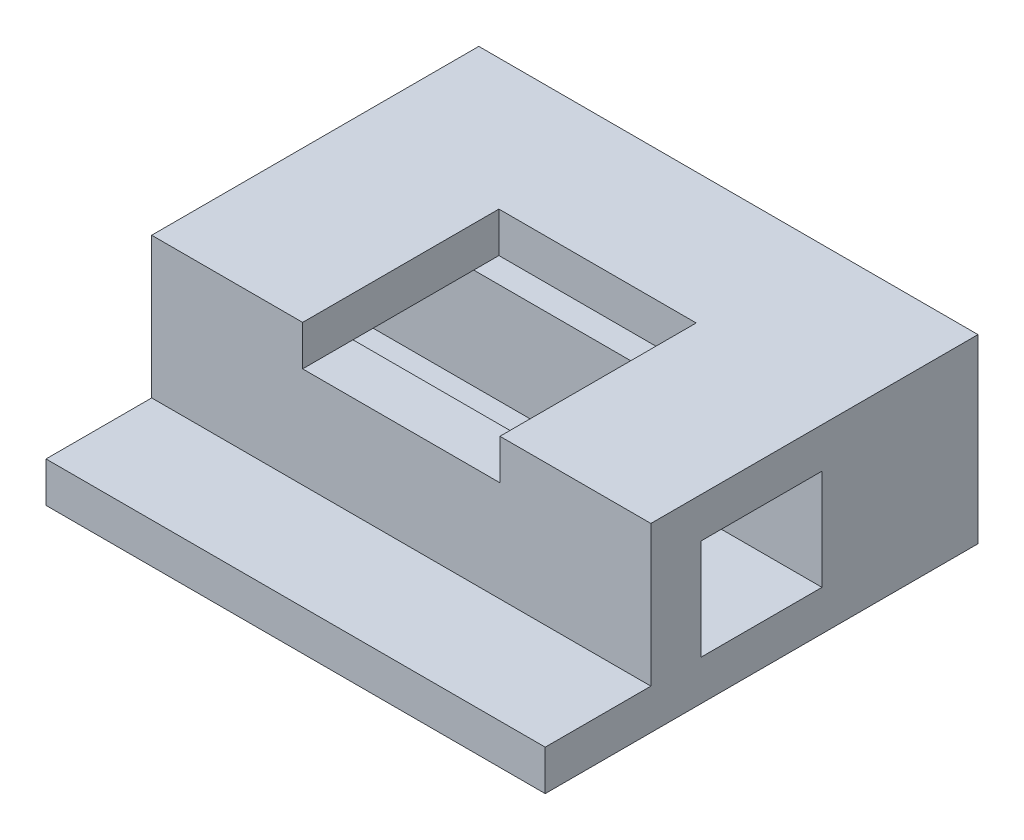
ISO-10303-21;
HEADER;
FILE_DESCRIPTION(('STEP AP214'),'2;1');
FILE_NAME('part.step','',(''),(''),'','','');
FILE_SCHEMA(('AUTOMOTIVE_DESIGN { 1 0 10303 214 1 1 1 1 }'));
ENDSEC;
DATA;
#1=APPLICATION_CONTEXT('core data for automotive mechanical design processes');
#2=APPLICATION_PROTOCOL_DEFINITION('international standard','automotive_design',2000,#1);
#3=PRODUCT_CONTEXT('',#1,'mechanical');
#4=PRODUCT('Part','Part','',(#3));
#5=PRODUCT_RELATED_PRODUCT_CATEGORY('part','',(#4));
#6=PRODUCT_DEFINITION_FORMATION('','',#4);
#7=PRODUCT_DEFINITION_CONTEXT('part definition',#1,'design');
#8=PRODUCT_DEFINITION('design','',#6,#7);
#9=PRODUCT_DEFINITION_SHAPE('','',#8);
#10=(LENGTH_UNIT() NAMED_UNIT(*) SI_UNIT(.MILLI.,.METRE.));
#11=(NAMED_UNIT(*) PLANE_ANGLE_UNIT() SI_UNIT($,.RADIAN.));
#12=(NAMED_UNIT(*) SI_UNIT($,.STERADIAN.) SOLID_ANGLE_UNIT());
#13=UNCERTAINTY_MEASURE_WITH_UNIT(LENGTH_MEASURE(1.E-05),#10,'distance_accuracy_value','');
#14=(GEOMETRIC_REPRESENTATION_CONTEXT(3) GLOBAL_UNCERTAINTY_ASSIGNED_CONTEXT((#13)) GLOBAL_UNIT_ASSIGNED_CONTEXT((#10,
#11,#12)) REPRESENTATION_CONTEXT('',''));
#15=CARTESIAN_POINT('',(0.,0.,0.));
#16=DIRECTION('',(0.,0.,1.));
#17=DIRECTION('',(1.,0.,0.));
#18=AXIS2_PLACEMENT_3D('',#15,#16,#17);
#19=CARTESIAN_POINT('',(-24.8,5.98999999999997,3.00000000000001));
#20=DIRECTION('',(0.,0.,1.));
#21=DIRECTION('',(1.,0.,0.));
#22=AXIS2_PLACEMENT_3D('',#19,#20,#21);
#23=PLANE('',#22);
#24=DIRECTION('',(0.,1.,0.));
#25=VECTOR('',#24,1.);
#26=CARTESIAN_POINT('',(24.8,0.,3.00000000000001));
#27=LINE('',#26,#25);
#28=CARTESIAN_POINT('',(24.8,5.99999999999999,3.00000000000001));
#29=VERTEX_POINT('',#28);
#30=CARTESIAN_POINT('',(24.8,10.,3.00000000000001));
#31=VERTEX_POINT('',#30);
#32=EDGE_CURVE('E40',#29,#31,#27,.T.);
#33=ORIENTED_EDGE('',*,*,#32,.T.);
#34=DIRECTION('',(-1.,0.,0.));
#35=VECTOR('',#34,1.);
#36=CARTESIAN_POINT('',(-35.,10.,3.00000000000001));
#37=LINE('',#36,#35);
#38=CARTESIAN_POINT('',(-24.8,10.,3.00000000000001));
#39=VERTEX_POINT('',#38);
#40=EDGE_CURVE('E169',#31,#39,#37,.T.);
#41=ORIENTED_EDGE('',*,*,#40,.T.);
#42=DIRECTION('',(0.,1.,0.));
#43=VECTOR('',#42,1.);
#44=CARTESIAN_POINT('',(-24.8,0.,3.00000000000001));
#45=LINE('',#44,#43);
#46=CARTESIAN_POINT('',(-24.8,5.99999999999999,3.00000000000001));
#47=VERTEX_POINT('',#46);
#48=EDGE_CURVE('E54',#47,#39,#45,.T.);
#49=ORIENTED_EDGE('',*,*,#48,.F.);
#50=DIRECTION('',(1.,0.,0.));
#51=VECTOR('',#50,1.);
#52=CARTESIAN_POINT('',(-50.,5.99999999999999,3.00000000000001));
#53=LINE('',#52,#51);
#54=EDGE_CURVE('E173',#47,#29,#53,.T.);
#55=ORIENTED_EDGE('',*,*,#54,.T.);
#56=EDGE_LOOP('',(#33,#41,#49,#55));
#57=FACE_BOUND('',#56,.T.);
#58=ADVANCED_FACE('F36',(#57),#23,.T.);
#59=CARTESIAN_POINT('',(-35.,10.,-35.));
#60=DIRECTION('',(0.,-1.,0.));
#61=DIRECTION('',(0.,0.,-1.));
#62=AXIS2_PLACEMENT_3D('',#59,#60,#61);
#63=PLANE('',#62);
#64=ORIENTED_EDGE('',*,*,#40,.F.);
#65=DIRECTION('',(0.,0.,-1.));
#66=VECTOR('',#65,1.);
#67=CARTESIAN_POINT('',(24.8,10.,3.));
#68=LINE('',#67,#66);
#69=CARTESIAN_POINT('',(24.8,10.,-7.49999999999999));
#70=VERTEX_POINT('',#69);
#71=EDGE_CURVE('E157',#31,#70,#68,.T.);
#72=ORIENTED_EDGE('',*,*,#71,.T.);
#73=DIRECTION('',(-1.,0.,0.));
#74=VECTOR('',#73,1.);
#75=CARTESIAN_POINT('',(15.,10.,-7.49999999999999));
#76=LINE('',#75,#74);
#77=CARTESIAN_POINT('',(-24.8,10.,-7.49999999999998));
#78=VERTEX_POINT('',#77);
#79=EDGE_CURVE('E204',#70,#78,#76,.T.);
#80=ORIENTED_EDGE('',*,*,#79,.T.);
#81=DIRECTION('',(0.,0.,1.));
#82=VECTOR('',#81,1.);
#83=CARTESIAN_POINT('',(-24.8,10.,3.));
#84=LINE('',#83,#82);
#85=EDGE_CURVE('E46',#78,#39,#84,.T.);
#86=ORIENTED_EDGE('',*,*,#85,.T.);
#87=EDGE_LOOP('',(#64,#72,#80,#86));
#88=FACE_BOUND('',#87,.T.);
#89=ADVANCED_FACE('F170',(#88),#63,.F.);
#90=CARTESIAN_POINT('',(-50.,6.,-40.));
#91=DIRECTION('',(0.,1.,0.));
#92=DIRECTION('',(0.,0.,1.));
#93=AXIS2_PLACEMENT_3D('',#90,#91,#92);
#94=PLANE('',#93);
#95=ORIENTED_EDGE('',*,*,#54,.F.);
#96=DIRECTION('',(0.,0.,1.));
#97=VECTOR('',#96,1.);
#98=CARTESIAN_POINT('',(-24.8,6.,-40.));
#99=LINE('',#98,#97);
#100=CARTESIAN_POINT('',(-24.8,6.00000000000001,-40.));
#101=VERTEX_POINT('',#100);
#102=EDGE_CURVE('E202',#101,#47,#99,.T.);
#103=ORIENTED_EDGE('',*,*,#102,.F.);
#104=DIRECTION('',(-1.,0.,0.));
#105=VECTOR('',#104,1.);
#106=CARTESIAN_POINT('',(-50.,6.00000000000001,-40.));
#107=LINE('',#106,#105);
#108=CARTESIAN_POINT('',(24.8,6.,-40.));
#109=VERTEX_POINT('',#108);
#110=EDGE_CURVE('E172',#109,#101,#107,.T.);
#111=ORIENTED_EDGE('',*,*,#110,.F.);
#112=DIRECTION('',(0.,0.,-1.));
#113=VECTOR('',#112,1.);
#114=CARTESIAN_POINT('',(24.8,6.,-40.));
#115=LINE('',#114,#113);
#116=EDGE_CURVE('E200',#29,#109,#115,.T.);
#117=ORIENTED_EDGE('',*,*,#116,.F.);
#118=EDGE_LOOP('',(#95,#103,#111,#117));
#119=FACE_BOUND('',#118,.T.);
#120=ADVANCED_FACE('F38',(#119),#94,.F.);
#121=CARTESIAN_POINT('',(-24.8,20.,-7.49999999999999));
#122=DIRECTION('',(0.,0.,-1.));
#123=DIRECTION('',(-1.,0.,0.));
#124=AXIS2_PLACEMENT_3D('',#121,#122,#123);
#125=PLANE('',#124);
#126=ORIENTED_EDGE('',*,*,#79,.F.);
#127=DIRECTION('',(0.,1.,0.));
#128=VECTOR('',#127,1.);
#129=CARTESIAN_POINT('',(24.8,-40.6992110392263,-7.5));
#130=LINE('',#129,#128);
#131=CARTESIAN_POINT('',(24.8,24.,-7.49999999999999));
#132=VERTEX_POINT('',#131);
#133=EDGE_CURVE('E165',#70,#132,#130,.T.);
#134=ORIENTED_EDGE('',*,*,#133,.T.);
#135=DIRECTION('',(-1.,0.,0.));
#136=VECTOR('',#135,1.);
#137=CARTESIAN_POINT('',(-24.8,24.,-7.49999999999999));
#138=LINE('',#137,#136);
#139=CARTESIAN_POINT('',(9.80000000000002,24.,-7.49999999999999));
#140=VERTEX_POINT('',#139);
#141=EDGE_CURVE('E194',#132,#140,#138,.T.);
#142=ORIENTED_EDGE('',*,*,#141,.T.);
#143=DIRECTION('',(0.,-1.,0.));
#144=VECTOR('',#143,1.);
#145=CARTESIAN_POINT('',(9.80000000000002,25.,-7.49999999999999));
#146=LINE('',#145,#144);
#147=CARTESIAN_POINT('',(9.80000000000002,20.,-7.49999999999999));
#148=VERTEX_POINT('',#147);
#149=EDGE_CURVE('E214',#140,#148,#146,.T.);
#150=ORIENTED_EDGE('',*,*,#149,.T.);
#151=DIRECTION('',(1.,0.,0.));
#152=VECTOR('',#151,1.);
#153=CARTESIAN_POINT('',(-24.8,20.,-7.49999999999999));
#154=LINE('',#153,#152);
#155=CARTESIAN_POINT('',(-9.8,20.,-7.49999999999999));
#156=VERTEX_POINT('',#155);
#157=EDGE_CURVE('E244',#156,#148,#154,.T.);
#158=ORIENTED_EDGE('',*,*,#157,.F.);
#159=DIRECTION('',(0.,-1.,0.));
#160=VECTOR('',#159,1.);
#161=CARTESIAN_POINT('',(-9.8,25.,-7.49999999999999));
#162=LINE('',#161,#160);
#163=CARTESIAN_POINT('',(-9.8,24.,-7.49999999999999));
#164=VERTEX_POINT('',#163);
#165=EDGE_CURVE('E234',#164,#156,#162,.T.);
#166=ORIENTED_EDGE('',*,*,#165,.F.);
#167=CARTESIAN_POINT('',(-24.8,24.,-7.49999999999998));
#168=VERTEX_POINT('',#167);
#169=EDGE_CURVE('E67',#164,#168,#138,.T.);
#170=ORIENTED_EDGE('',*,*,#169,.T.);
#171=DIRECTION('',(0.,1.,0.));
#172=VECTOR('',#171,1.);
#173=CARTESIAN_POINT('',(-24.8,-40.6992110392263,-7.49999999999999));
#174=LINE('',#173,#172);
#175=EDGE_CURVE('E11',#78,#168,#174,.T.);
#176=ORIENTED_EDGE('',*,*,#175,.F.);
#177=EDGE_LOOP('',(#126,#134,#142,#150,#158,#166,#170,#176));
#178=FACE_BOUND('',#177,.T.);
#179=ADVANCED_FACE('F283',(#178),#125,.F.);
#180=CARTESIAN_POINT('',(-24.8,89.2753352012447,-27.));
#181=DIRECTION('',(0.,0.,-1.));
#182=DIRECTION('',(-1.,0.,0.));
#183=AXIS2_PLACEMENT_3D('',#180,#181,#182);
#184=PLANE('',#183);
#185=DIRECTION('',(0.,1.,0.));
#186=VECTOR('',#185,1.);
#187=CARTESIAN_POINT('',(9.80000000000002,20.,-27.));
#188=LINE('',#187,#186);
#189=CARTESIAN_POINT('',(9.80000000000002,20.,-27.));
#190=VERTEX_POINT('',#189);
#191=CARTESIAN_POINT('',(9.80000000000002,24.,-27.));
#192=VERTEX_POINT('',#191);
#193=EDGE_CURVE('E206',#190,#192,#188,.T.);
#194=ORIENTED_EDGE('',*,*,#193,.T.);
#195=DIRECTION('',(-1.,0.,0.));
#196=VECTOR('',#195,1.);
#197=CARTESIAN_POINT('',(-24.8,24.,-27.));
#198=LINE('',#197,#196);
#199=CARTESIAN_POINT('',(-9.80000000000001,24.,-27.));
#200=VERTEX_POINT('',#199);
#201=EDGE_CURVE('E191',#192,#200,#198,.T.);
#202=ORIENTED_EDGE('',*,*,#201,.T.);
#203=DIRECTION('',(0.,-1.,0.));
#204=VECTOR('',#203,1.);
#205=CARTESIAN_POINT('',(-9.80000000000001,25.,-27.));
#206=LINE('',#205,#204);
#207=CARTESIAN_POINT('',(-9.80000000000001,20.,-27.));
#208=VERTEX_POINT('',#207);
#209=EDGE_CURVE('E209',#200,#208,#206,.T.);
#210=ORIENTED_EDGE('',*,*,#209,.T.);
#211=DIRECTION('',(1.,0.,0.));
#212=VECTOR('',#211,1.);
#213=CARTESIAN_POINT('',(-9.80000000000001,20.,-27.));
#214=LINE('',#213,#212);
#215=EDGE_CURVE('E211',#208,#190,#214,.T.);
#216=ORIENTED_EDGE('',*,*,#215,.T.);
#217=EDGE_LOOP('',(#194,#202,#210,#216));
#218=FACE_BOUND('',#217,.T.);
#219=ADVANCED_FACE('F328',(#218),#184,.F.);
#220=CARTESIAN_POINT('',(0.,20.,0.));
#221=DIRECTION('',(0.,1.,0.));
#222=DIRECTION('',(0.,0.,1.));
#223=AXIS2_PLACEMENT_3D('',#220,#221,#222);
#224=PLANE('',#223);
#225=DIRECTION('',(0.,0.,1.));
#226=VECTOR('',#225,1.);
#227=CARTESIAN_POINT('',(9.80000000000002,20.,-29.5));
#228=LINE('',#227,#226);
#229=CARTESIAN_POINT('',(9.80000000000002,20.,-24.5));
#230=VERTEX_POINT('',#229);
#231=EDGE_CURVE('E217',#190,#230,#228,.T.);
#232=ORIENTED_EDGE('',*,*,#231,.F.);
#233=ORIENTED_EDGE('',*,*,#215,.F.);
#234=DIRECTION('',(0.,0.,-1.));
#235=VECTOR('',#234,1.);
#236=CARTESIAN_POINT('',(-9.80000000000001,20.,-29.5));
#237=LINE('',#236,#235);
#238=CARTESIAN_POINT('',(-9.80000000000001,20.,-24.5));
#239=VERTEX_POINT('',#238);
#240=EDGE_CURVE('E229',#239,#208,#237,.T.);
#241=ORIENTED_EDGE('',*,*,#240,.F.);
#242=DIRECTION('',(1.,0.,0.));
#243=VECTOR('',#242,1.);
#244=CARTESIAN_POINT('',(-24.8,20.,-24.5));
#245=LINE('',#244,#243);
#246=EDGE_CURVE('E255',#239,#230,#245,.T.);
#247=ORIENTED_EDGE('',*,*,#246,.T.);
#248=EDGE_LOOP('',(#232,#233,#241,#247));
#249=FACE_BOUND('',#248,.T.);
#250=ADVANCED_FACE('F326',(#249),#224,.T.);
#251=CARTESIAN_POINT('',(-9.80000000000001,25.,-29.5));
#252=DIRECTION('',(-1.,0.,0.));
#253=DIRECTION('',(0.,0.,1.));
#254=AXIS2_PLACEMENT_3D('',#251,#252,#253);
#255=PLANE('',#254);
#256=ORIENTED_EDGE('',*,*,#209,.F.);
#257=DIRECTION('',(0.,0.,1.));
#258=VECTOR('',#257,1.);
#259=CARTESIAN_POINT('',(-9.80000000000001,24.,-29.5));
#260=LINE('',#259,#258);
#261=EDGE_CURVE('E197',#200,#164,#260,.T.);
#262=ORIENTED_EDGE('',*,*,#261,.T.);
#263=ORIENTED_EDGE('',*,*,#165,.T.);
#264=CARTESIAN_POINT('',(-9.8,20.,-12.5));
#265=VERTEX_POINT('',#264);
#266=EDGE_CURVE('E230',#156,#265,#237,.T.);
#267=ORIENTED_EDGE('',*,*,#266,.T.);
#268=EDGE_CURVE('E233',#265,#239,#237,.T.);
#269=ORIENTED_EDGE('',*,*,#268,.T.);
#270=ORIENTED_EDGE('',*,*,#240,.T.);
#271=EDGE_LOOP('',(#256,#262,#263,#267,#269,#270));
#272=FACE_BOUND('',#271,.T.);
#273=ADVANCED_FACE('F286',(#272),#255,.F.);
#274=CARTESIAN_POINT('',(9.80000000000002,25.,-29.5));
#275=DIRECTION('',(1.,0.,0.));
#276=DIRECTION('',(0.,0.,-1.));
#277=AXIS2_PLACEMENT_3D('',#274,#275,#276);
#278=PLANE('',#277);
#279=ORIENTED_EDGE('',*,*,#149,.F.);
#280=DIRECTION('',(0.,0.,-1.));
#281=VECTOR('',#280,1.);
#282=CARTESIAN_POINT('',(9.80000000000002,24.,-29.5));
#283=LINE('',#282,#281);
#284=EDGE_CURVE('E188',#140,#192,#283,.T.);
#285=ORIENTED_EDGE('',*,*,#284,.T.);
#286=ORIENTED_EDGE('',*,*,#193,.F.);
#287=ORIENTED_EDGE('',*,*,#231,.T.);
#288=CARTESIAN_POINT('',(9.80000000000002,20.,-12.5));
#289=VERTEX_POINT('',#288);
#290=EDGE_CURVE('E219',#230,#289,#228,.T.);
#291=ORIENTED_EDGE('',*,*,#290,.T.);
#292=EDGE_CURVE('E216',#289,#148,#228,.T.);
#293=ORIENTED_EDGE('',*,*,#292,.T.);
#294=EDGE_LOOP('',(#279,#285,#286,#287,#291,#293));
#295=FACE_BOUND('',#294,.T.);
#296=ADVANCED_FACE('F296',(#295),#278,.F.);
#297=CARTESIAN_POINT('',(0.,20.,0.));
#298=DIRECTION('',(0.,1.,0.));
#299=DIRECTION('',(0.,0.,1.));
#300=AXIS2_PLACEMENT_3D('',#297,#298,#299);
#301=PLANE('',#300);
#302=ORIENTED_EDGE('',*,*,#157,.T.);
#303=ORIENTED_EDGE('',*,*,#292,.F.);
#304=DIRECTION('',(-1.,0.,0.));
#305=VECTOR('',#304,1.);
#306=CARTESIAN_POINT('',(-24.8,20.,-12.5));
#307=LINE('',#306,#305);
#308=EDGE_CURVE('E249',#289,#265,#307,.T.);
#309=ORIENTED_EDGE('',*,*,#308,.T.);
#310=ORIENTED_EDGE('',*,*,#266,.F.);
#311=EDGE_LOOP('',(#302,#303,#309,#310));
#312=FACE_BOUND('',#311,.T.);
#313=ADVANCED_FACE('F293',(#312),#301,.T.);
#314=DIRECTION('',(-1.,0.,0.));
#315=VECTOR('',#314,1.);
#316=CARTESIAN_POINT('',(-24.8,10.,-12.5));
#317=LINE('',#316,#315);
#318=CARTESIAN_POINT('',(24.8,10.,-12.5));
#319=VERTEX_POINT('',#318);
#320=CARTESIAN_POINT('',(-24.8,10.,-12.5));
#321=VERTEX_POINT('',#320);
#322=EDGE_CURVE('E241',#319,#321,#317,.T.);
#323=ORIENTED_EDGE('',*,*,#322,.F.);
#324=DIRECTION('',(0.,0.,1.));
#325=VECTOR('',#324,1.);
#326=CARTESIAN_POINT('',(24.8,10.,-40.));
#327=LINE('',#326,#325);
#328=CARTESIAN_POINT('',(24.8,10.,-24.5));
#329=VERTEX_POINT('',#328);
#330=EDGE_CURVE('E266',#329,#319,#327,.T.);
#331=ORIENTED_EDGE('',*,*,#330,.F.);
#332=DIRECTION('',(1.,0.,0.));
#333=VECTOR('',#332,1.);
#334=CARTESIAN_POINT('',(-24.8,10.,-24.5));
#335=LINE('',#334,#333);
#336=CARTESIAN_POINT('',(-24.8,10.,-24.5));
#337=VERTEX_POINT('',#336);
#338=EDGE_CURVE('E245',#337,#329,#335,.T.);
#339=ORIENTED_EDGE('',*,*,#338,.F.);
#340=DIRECTION('',(0.,0.,-1.));
#341=VECTOR('',#340,1.);
#342=CARTESIAN_POINT('',(-24.8,10.,-40.));
#343=LINE('',#342,#341);
#344=EDGE_CURVE('E264',#321,#337,#343,.T.);
#345=ORIENTED_EDGE('',*,*,#344,.F.);
#346=EDGE_LOOP('',(#323,#331,#339,#345));
#347=FACE_BOUND('',#346,.T.);
#348=ADVANCED_FACE('F319',(#347),#63,.F.);
#349=CARTESIAN_POINT('',(24.8,0.,-40.));
#350=DIRECTION('',(-1.,0.,0.));
#351=DIRECTION('',(0.,0.,1.));
#352=AXIS2_PLACEMENT_3D('',#349,#350,#351);
#353=PLANE('',#352);
#354=ORIENTED_EDGE('',*,*,#133,.F.);
#355=ORIENTED_EDGE('',*,*,#71,.F.);
#356=ORIENTED_EDGE('',*,*,#32,.F.);
#357=ORIENTED_EDGE('',*,*,#116,.T.);
#358=DIRECTION('',(0.,1.,0.));
#359=VECTOR('',#358,1.);
#360=CARTESIAN_POINT('',(24.8,0.,-40.));
#361=LINE('',#360,#359);
#362=CARTESIAN_POINT('',(24.8,24.,-40.));
#363=VERTEX_POINT('',#362);
#364=EDGE_CURVE('E263',#109,#363,#361,.T.);
#365=ORIENTED_EDGE('',*,*,#364,.T.);
#366=DIRECTION('',(0.,0.,1.));
#367=VECTOR('',#366,1.);
#368=CARTESIAN_POINT('',(24.8,24.,-40.));
#369=LINE('',#368,#367);
#370=EDGE_CURVE('E186',#363,#132,#369,.T.);
#371=ORIENTED_EDGE('',*,*,#370,.T.);
#372=EDGE_LOOP('',(#354,#355,#356,#357,#365,#371));
#373=FACE_BOUND('',#372,.T.);
#374=DIRECTION('',(0.,0.,-1.));
#375=VECTOR('',#374,1.);
#376=CARTESIAN_POINT('',(24.8,20.,-29.5));
#377=LINE('',#376,#375);
#378=CARTESIAN_POINT('',(24.8,20.,-12.5));
#379=VERTEX_POINT('',#378);
#380=CARTESIAN_POINT('',(24.8,20.,-24.5));
#381=VERTEX_POINT('',#380);
#382=EDGE_CURVE('E220',#379,#381,#377,.T.);
#383=ORIENTED_EDGE('',*,*,#382,.T.);
#384=DIRECTION('',(0.,-1.,0.));
#385=VECTOR('',#384,1.);
#386=CARTESIAN_POINT('',(24.8,20.,-24.5));
#387=LINE('',#386,#385);
#388=EDGE_CURVE('E256',#381,#329,#387,.T.);
#389=ORIENTED_EDGE('',*,*,#388,.T.);
#390=ORIENTED_EDGE('',*,*,#330,.T.);
#391=DIRECTION('',(0.,-1.,0.));
#392=VECTOR('',#391,1.);
#393=CARTESIAN_POINT('',(24.8,20.,-12.5));
#394=LINE('',#393,#392);
#395=EDGE_CURVE('E236',#379,#319,#394,.T.);
#396=ORIENTED_EDGE('',*,*,#395,.F.);
#397=EDGE_LOOP('',(#383,#389,#390,#396));
#398=FACE_BOUND('',#397,.T.);
#399=ADVANCED_FACE('F159',(#373,#398),#353,.F.);
#400=CARTESIAN_POINT('',(-24.8,0.,-40.));
#401=DIRECTION('',(1.,0.,0.));
#402=DIRECTION('',(0.,0.,-1.));
#403=AXIS2_PLACEMENT_3D('',#400,#401,#402);
#404=PLANE('',#403);
#405=ORIENTED_EDGE('',*,*,#48,.T.);
#406=ORIENTED_EDGE('',*,*,#85,.F.);
#407=ORIENTED_EDGE('',*,*,#175,.T.);
#408=DIRECTION('',(0.,0.,-1.));
#409=VECTOR('',#408,1.);
#410=CARTESIAN_POINT('',(-24.8,24.,-40.));
#411=LINE('',#410,#409);
#412=CARTESIAN_POINT('',(-24.8,24.,-40.));
#413=VERTEX_POINT('',#412);
#414=EDGE_CURVE('E73',#168,#413,#411,.T.);
#415=ORIENTED_EDGE('',*,*,#414,.T.);
#416=DIRECTION('',(0.,1.,0.));
#417=VECTOR('',#416,1.);
#418=CARTESIAN_POINT('',(-24.8,0.,-40.));
#419=LINE('',#418,#417);
#420=EDGE_CURVE('E178',#101,#413,#419,.T.);
#421=ORIENTED_EDGE('',*,*,#420,.F.);
#422=ORIENTED_EDGE('',*,*,#102,.T.);
#423=EDGE_LOOP('',(#405,#406,#407,#415,#421,#422));
#424=FACE_BOUND('',#423,.T.);
#425=DIRECTION('',(0.,-1.,0.));
#426=VECTOR('',#425,1.);
#427=CARTESIAN_POINT('',(-24.8,20.,-24.5));
#428=LINE('',#427,#426);
#429=CARTESIAN_POINT('',(-24.8,20.,-24.5));
#430=VERTEX_POINT('',#429);
#431=EDGE_CURVE('E260',#430,#337,#428,.T.);
#432=ORIENTED_EDGE('',*,*,#431,.F.);
#433=DIRECTION('',(0.,0.,1.));
#434=VECTOR('',#433,1.);
#435=CARTESIAN_POINT('',(-24.8,20.,-29.5));
#436=LINE('',#435,#434);
#437=CARTESIAN_POINT('',(-24.8,20.,-12.5));
#438=VERTEX_POINT('',#437);
#439=EDGE_CURVE('E226',#430,#438,#436,.T.);
#440=ORIENTED_EDGE('',*,*,#439,.T.);
#441=DIRECTION('',(0.,-1.,0.));
#442=VECTOR('',#441,1.);
#443=CARTESIAN_POINT('',(-24.8,20.,-12.5));
#444=LINE('',#443,#442);
#445=EDGE_CURVE('E238',#438,#321,#444,.T.);
#446=ORIENTED_EDGE('',*,*,#445,.T.);
#447=ORIENTED_EDGE('',*,*,#344,.T.);
#448=EDGE_LOOP('',(#432,#440,#446,#447));
#449=FACE_BOUND('',#448,.T.);
#450=ADVANCED_FACE('F278',(#424,#449),#404,.F.);
#451=CARTESIAN_POINT('',(-24.8,20.,-24.5));
#452=DIRECTION('',(0.,0.,-1.));
#453=DIRECTION('',(-1.,0.,0.));
#454=AXIS2_PLACEMENT_3D('',#451,#452,#453);
#455=PLANE('',#454);
#456=ORIENTED_EDGE('',*,*,#338,.T.);
#457=ORIENTED_EDGE('',*,*,#388,.F.);
#458=DIRECTION('',(-1.,0.,0.));
#459=VECTOR('',#458,1.);
#460=CARTESIAN_POINT('',(-24.8,20.,-24.5));
#461=LINE('',#460,#459);
#462=EDGE_CURVE('E223',#381,#230,#461,.T.);
#463=ORIENTED_EDGE('',*,*,#462,.T.);
#464=ORIENTED_EDGE('',*,*,#246,.F.);
#465=EDGE_CURVE('E252',#430,#239,#245,.T.);
#466=ORIENTED_EDGE('',*,*,#465,.F.);
#467=ORIENTED_EDGE('',*,*,#431,.T.);
#468=EDGE_LOOP('',(#456,#457,#463,#464,#466,#467));
#469=FACE_BOUND('',#468,.T.);
#470=ADVANCED_FACE('F321',(#469),#455,.F.);
#471=CARTESIAN_POINT('',(-24.8,20.,-12.5));
#472=DIRECTION('',(0.,0.,1.));
#473=DIRECTION('',(1.,0.,0.));
#474=AXIS2_PLACEMENT_3D('',#471,#472,#473);
#475=PLANE('',#474);
#476=ORIENTED_EDGE('',*,*,#322,.T.);
#477=ORIENTED_EDGE('',*,*,#445,.F.);
#478=EDGE_CURVE('E240',#265,#438,#307,.T.);
#479=ORIENTED_EDGE('',*,*,#478,.F.);
#480=ORIENTED_EDGE('',*,*,#308,.F.);
#481=EDGE_CURVE('E246',#379,#289,#307,.T.);
#482=ORIENTED_EDGE('',*,*,#481,.F.);
#483=ORIENTED_EDGE('',*,*,#395,.T.);
#484=EDGE_LOOP('',(#476,#477,#479,#480,#482,#483));
#485=FACE_BOUND('',#484,.T.);
#486=ADVANCED_FACE('F305',(#485),#475,.F.);
#487=CARTESIAN_POINT('',(0.,20.,0.));
#488=DIRECTION('',(0.,1.,0.));
#489=DIRECTION('',(0.,0.,1.));
#490=AXIS2_PLACEMENT_3D('',#487,#488,#489);
#491=PLANE('',#490);
#492=ORIENTED_EDGE('',*,*,#439,.F.);
#493=ORIENTED_EDGE('',*,*,#465,.T.);
#494=ORIENTED_EDGE('',*,*,#268,.F.);
#495=ORIENTED_EDGE('',*,*,#478,.T.);
#496=EDGE_LOOP('',(#492,#493,#494,#495));
#497=FACE_BOUND('',#496,.T.);
#498=ADVANCED_FACE('F312',(#497),#491,.F.);
#499=CARTESIAN_POINT('',(0.,20.,0.));
#500=DIRECTION('',(0.,-1.,0.));
#501=DIRECTION('',(0.,0.,-1.));
#502=AXIS2_PLACEMENT_3D('',#499,#500,#501);
#503=PLANE('',#502);
#504=ORIENTED_EDGE('',*,*,#462,.F.);
#505=ORIENTED_EDGE('',*,*,#382,.F.);
#506=ORIENTED_EDGE('',*,*,#481,.T.);
#507=ORIENTED_EDGE('',*,*,#290,.F.);
#508=EDGE_LOOP('',(#504,#505,#506,#507));
#509=FACE_BOUND('',#508,.T.);
#510=ADVANCED_FACE('F301',(#509),#503,.T.);
#511=CARTESIAN_POINT('',(-50.,-101.980390271856,-40.));
#512=DIRECTION('',(0.,0.,1.));
#513=DIRECTION('',(1.,0.,0.));
#514=AXIS2_PLACEMENT_3D('',#511,#512,#513);
#515=PLANE('',#514);
#516=ORIENTED_EDGE('',*,*,#420,.T.);
#517=DIRECTION('',(1.,0.,0.));
#518=VECTOR('',#517,1.);
#519=CARTESIAN_POINT('',(-49.6855533243016,24.,-40.));
#520=LINE('',#519,#518);
#521=EDGE_CURVE('E182',#413,#363,#520,.T.);
#522=ORIENTED_EDGE('',*,*,#521,.T.);
#523=ORIENTED_EDGE('',*,*,#364,.F.);
#524=ORIENTED_EDGE('',*,*,#110,.T.);
#525=EDGE_LOOP('',(#516,#522,#523,#524));
#526=FACE_BOUND('',#525,.T.);
#527=ADVANCED_FACE('F276',(#526),#515,.F.);
#528=CARTESIAN_POINT('',(-49.6855533243016,24.,-40.));
#529=DIRECTION('',(0.,-1.,0.));
#530=DIRECTION('',(0.,0.,-1.));
#531=AXIS2_PLACEMENT_3D('',#528,#529,#530);
#532=PLANE('',#531);
#533=ORIENTED_EDGE('',*,*,#414,.F.);
#534=ORIENTED_EDGE('',*,*,#169,.F.);
#535=ORIENTED_EDGE('',*,*,#261,.F.);
#536=ORIENTED_EDGE('',*,*,#201,.F.);
#537=ORIENTED_EDGE('',*,*,#284,.F.);
#538=ORIENTED_EDGE('',*,*,#141,.F.);
#539=ORIENTED_EDGE('',*,*,#370,.F.);
#540=ORIENTED_EDGE('',*,*,#521,.F.);
#541=EDGE_LOOP('',(#533,#534,#535,#536,#537,#538,#539,#540));
#542=FACE_BOUND('',#541,.T.);
#543=ADVANCED_FACE('F281',(#542),#532,.F.);
#544=CLOSED_SHELL('',(#58,#89,#120,#179,#219,#250,#273,#296,#313,#348,#399,#450,#470,#486,#498,
#510,#527,#543));
#545=MANIFOLD_SOLID_BREP('B2',#544);
#546=ADVANCED_BREP_SHAPE_REPRESENTATION('',(#18,#545),#14);
#547=SHAPE_DEFINITION_REPRESENTATION(#9,#546);
ENDSEC;
END-ISO-10303-21;
